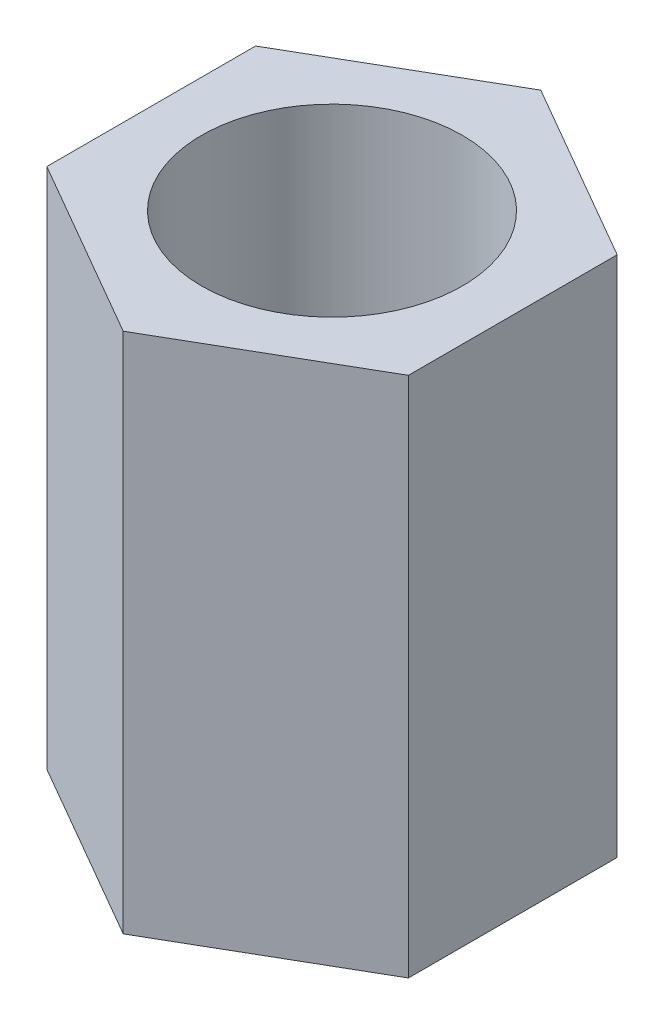
ISO-10303-21;
HEADER;
FILE_DESCRIPTION(('STEP AP214'),'2;1');
FILE_NAME('part.step','',(''),(''),'','','');
FILE_SCHEMA(('AUTOMOTIVE_DESIGN { 1 0 10303 214 1 1 1 1 }'));
ENDSEC;
DATA;
#1=APPLICATION_CONTEXT('core data for automotive mechanical design processes');
#2=APPLICATION_PROTOCOL_DEFINITION('international standard','automotive_design',2000,#1);
#3=PRODUCT_CONTEXT('',#1,'mechanical');
#4=PRODUCT('Part','Part','',(#3));
#5=PRODUCT_RELATED_PRODUCT_CATEGORY('part','',(#4));
#6=PRODUCT_DEFINITION_FORMATION('','',#4);
#7=PRODUCT_DEFINITION_CONTEXT('part definition',#1,'design');
#8=PRODUCT_DEFINITION('design','',#6,#7);
#9=PRODUCT_DEFINITION_SHAPE('','',#8);
#10=(LENGTH_UNIT() NAMED_UNIT(*) SI_UNIT(.MILLI.,.METRE.));
#11=(NAMED_UNIT(*) PLANE_ANGLE_UNIT() SI_UNIT($,.RADIAN.));
#12=(NAMED_UNIT(*) SI_UNIT($,.STERADIAN.) SOLID_ANGLE_UNIT());
#13=UNCERTAINTY_MEASURE_WITH_UNIT(LENGTH_MEASURE(1.E-05),#10,'distance_accuracy_value','');
#14=(GEOMETRIC_REPRESENTATION_CONTEXT(3) GLOBAL_UNCERTAINTY_ASSIGNED_CONTEXT((#13)) GLOBAL_UNIT_ASSIGNED_CONTEXT((#10,
#11,#12)) REPRESENTATION_CONTEXT('',''));
#15=CARTESIAN_POINT('',(0.,0.,0.));
#16=DIRECTION('',(0.,0.,1.));
#17=DIRECTION('',(1.,0.,0.));
#18=AXIS2_PLACEMENT_3D('',#15,#16,#17);
#19=CARTESIAN_POINT('',(0.,5.,0.));
#20=DIRECTION('',(0.,1.,0.));
#21=DIRECTION('',(0.,0.,1.));
#22=AXIS2_PLACEMENT_3D('',#19,#20,#21);
#23=PLANE('',#22);
#24=DIRECTION('',(-0.866025403784439,0.,-0.5));
#25=VECTOR('',#24,1.);
#26=CARTESIAN_POINT('',(1.73205080756888,5.,-1.));
#27=LINE('',#26,#25);
#28=CARTESIAN_POINT('',(1.73205080756888,5.,-1.));
#29=VERTEX_POINT('',#28);
#30=CARTESIAN_POINT('',(0.,5.,-2.));
#31=VERTEX_POINT('',#30);
#32=EDGE_CURVE('E137',#29,#31,#27,.T.);
#33=ORIENTED_EDGE('',*,*,#32,.T.);
#34=DIRECTION('',(-0.866025403784439,0.,0.5));
#35=VECTOR('',#34,1.);
#36=CARTESIAN_POINT('',(0.,5.,-2.));
#37=LINE('',#36,#35);
#38=CARTESIAN_POINT('',(-1.73205080756888,5.,-1.));
#39=VERTEX_POINT('',#38);
#40=EDGE_CURVE('E95',#31,#39,#37,.T.);
#41=ORIENTED_EDGE('',*,*,#40,.T.);
#42=DIRECTION('',(0.,0.,1.));
#43=VECTOR('',#42,1.);
#44=CARTESIAN_POINT('',(-1.73205080756888,5.,-1.));
#45=LINE('',#44,#43);
#46=CARTESIAN_POINT('',(-1.73205080756888,5.,1.));
#47=VERTEX_POINT('',#46);
#48=EDGE_CURVE('E108',#39,#47,#45,.T.);
#49=ORIENTED_EDGE('',*,*,#48,.T.);
#50=DIRECTION('',(0.866025403784439,0.,0.5));
#51=VECTOR('',#50,1.);
#52=CARTESIAN_POINT('',(-1.73205080756888,5.,1.));
#53=LINE('',#52,#51);
#54=CARTESIAN_POINT('',(0.,5.,2.));
#55=VERTEX_POINT('',#54);
#56=EDGE_CURVE('E102',#47,#55,#53,.T.);
#57=ORIENTED_EDGE('',*,*,#56,.T.);
#58=DIRECTION('',(0.866025403784439,0.,-0.5));
#59=VECTOR('',#58,1.);
#60=CARTESIAN_POINT('',(0.,5.,2.));
#61=LINE('',#60,#59);
#62=CARTESIAN_POINT('',(1.73205080756888,5.,1.));
#63=VERTEX_POINT('',#62);
#64=EDGE_CURVE('E106',#55,#63,#61,.T.);
#65=ORIENTED_EDGE('',*,*,#64,.T.);
#66=DIRECTION('',(0.,0.,-1.));
#67=VECTOR('',#66,1.);
#68=CARTESIAN_POINT('',(1.73205080756888,5.,1.));
#69=LINE('',#68,#67);
#70=EDGE_CURVE('E58',#63,#29,#69,.T.);
#71=ORIENTED_EDGE('',*,*,#70,.T.);
#72=EDGE_LOOP('',(#33,#41,#49,#57,#65,#71));
#73=FACE_BOUND('',#72,.T.);
#74=CARTESIAN_POINT('',(0.,5.,0.));
#75=DIRECTION('',(0.,1.,0.));
#76=DIRECTION('',(0.,0.,1.));
#77=AXIS2_PLACEMENT_3D('',#74,#75,#76);
#78=CIRCLE('',#77,1.25);
#79=CARTESIAN_POINT('',(0.,5.,1.25));
#80=VERTEX_POINT('',#79);
#81=EDGE_CURVE('E130',#80,#80,#78,.T.);
#82=ORIENTED_EDGE('',*,*,#81,.F.);
#83=EDGE_LOOP('',(#82));
#84=FACE_BOUND('',#83,.T.);
#85=ADVANCED_FACE('F41',(#73,#84),#23,.T.);
#86=CARTESIAN_POINT('',(0.,0.,0.));
#87=DIRECTION('',(0.,1.,0.));
#88=DIRECTION('',(0.,0.,1.));
#89=AXIS2_PLACEMENT_3D('',#86,#87,#88);
#90=PLANE('',#89);
#91=DIRECTION('',(-0.866025403784439,0.,-0.5));
#92=VECTOR('',#91,1.);
#93=CARTESIAN_POINT('',(1.73205080756888,0.,-1.));
#94=LINE('',#93,#92);
#95=CARTESIAN_POINT('',(1.73205080756888,0.,-1.));
#96=VERTEX_POINT('',#95);
#97=CARTESIAN_POINT('',(0.,0.,-2.));
#98=VERTEX_POINT('',#97);
#99=EDGE_CURVE('E126',#96,#98,#94,.T.);
#100=ORIENTED_EDGE('',*,*,#99,.F.);
#101=DIRECTION('',(0.,0.,-1.));
#102=VECTOR('',#101,1.);
#103=CARTESIAN_POINT('',(1.73205080756888,0.,1.));
#104=LINE('',#103,#102);
#105=CARTESIAN_POINT('',(1.73205080756888,0.,1.));
#106=VERTEX_POINT('',#105);
#107=EDGE_CURVE('E87',#106,#96,#104,.T.);
#108=ORIENTED_EDGE('',*,*,#107,.F.);
#109=DIRECTION('',(0.866025403784439,0.,-0.5));
#110=VECTOR('',#109,1.);
#111=CARTESIAN_POINT('',(0.,0.,2.));
#112=LINE('',#111,#110);
#113=CARTESIAN_POINT('',(0.,0.,2.));
#114=VERTEX_POINT('',#113);
#115=EDGE_CURVE('E81',#114,#106,#112,.T.);
#116=ORIENTED_EDGE('',*,*,#115,.F.);
#117=DIRECTION('',(0.866025403784439,0.,0.5));
#118=VECTOR('',#117,1.);
#119=CARTESIAN_POINT('',(-1.73205080756888,0.,1.));
#120=LINE('',#119,#118);
#121=CARTESIAN_POINT('',(-1.73205080756888,0.,1.));
#122=VERTEX_POINT('',#121);
#123=EDGE_CURVE('E116',#122,#114,#120,.T.);
#124=ORIENTED_EDGE('',*,*,#123,.F.);
#125=DIRECTION('',(0.,0.,1.));
#126=VECTOR('',#125,1.);
#127=CARTESIAN_POINT('',(-1.73205080756888,0.,-1.));
#128=LINE('',#127,#126);
#129=CARTESIAN_POINT('',(-1.73205080756888,0.,-1.));
#130=VERTEX_POINT('',#129);
#131=EDGE_CURVE('E132',#130,#122,#128,.T.);
#132=ORIENTED_EDGE('',*,*,#131,.F.);
#133=DIRECTION('',(-0.866025403784439,0.,0.5));
#134=VECTOR('',#133,1.);
#135=CARTESIAN_POINT('',(0.,0.,-2.));
#136=LINE('',#135,#134);
#137=EDGE_CURVE('E129',#98,#130,#136,.T.);
#138=ORIENTED_EDGE('',*,*,#137,.F.);
#139=EDGE_LOOP('',(#100,#108,#116,#124,#132,#138));
#140=FACE_BOUND('',#139,.T.);
#141=CARTESIAN_POINT('',(0.,0.,0.));
#142=DIRECTION('',(0.,1.,0.));
#143=DIRECTION('',(0.,0.,1.));
#144=AXIS2_PLACEMENT_3D('',#141,#142,#143);
#145=CIRCLE('',#144,1.25);
#146=CARTESIAN_POINT('',(0.,0.,1.25));
#147=VERTEX_POINT('',#146);
#148=EDGE_CURVE('E230',#147,#147,#145,.T.);
#149=ORIENTED_EDGE('',*,*,#148,.T.);
#150=EDGE_LOOP('',(#149));
#151=FACE_BOUND('',#150,.T.);
#152=ADVANCED_FACE('F146',(#140,#151),#90,.F.);
#153=CARTESIAN_POINT('',(1.73205080756888,5.,-1.));
#154=DIRECTION('',(-0.5,0.,0.866025403784439));
#155=DIRECTION('',(0.866025403784439,0.,0.5));
#156=AXIS2_PLACEMENT_3D('',#153,#154,#155);
#157=PLANE('',#156);
#158=ORIENTED_EDGE('',*,*,#99,.T.);
#159=DIRECTION('',(0.,-1.,0.));
#160=VECTOR('',#159,1.);
#161=CARTESIAN_POINT('',(0.,5.,-2.));
#162=LINE('',#161,#160);
#163=EDGE_CURVE('E11',#31,#98,#162,.T.);
#164=ORIENTED_EDGE('',*,*,#163,.F.);
#165=ORIENTED_EDGE('',*,*,#32,.F.);
#166=DIRECTION('',(0.,-1.,0.));
#167=VECTOR('',#166,1.);
#168=CARTESIAN_POINT('',(1.73205080756888,5.,-1.));
#169=LINE('',#168,#167);
#170=EDGE_CURVE('E122',#29,#96,#169,.T.);
#171=ORIENTED_EDGE('',*,*,#170,.T.);
#172=EDGE_LOOP('',(#158,#164,#165,#171));
#173=FACE_BOUND('',#172,.T.);
#174=ADVANCED_FACE('F43',(#173),#157,.F.);
#175=CARTESIAN_POINT('',(0.,5.,-2.));
#176=DIRECTION('',(0.5,0.,0.866025403784439));
#177=DIRECTION('',(0.866025403784439,0.,-0.5));
#178=AXIS2_PLACEMENT_3D('',#175,#176,#177);
#179=PLANE('',#178);
#180=ORIENTED_EDGE('',*,*,#137,.T.);
#181=DIRECTION('',(0.,-1.,0.));
#182=VECTOR('',#181,1.);
#183=CARTESIAN_POINT('',(-1.73205080756888,5.,-1.));
#184=LINE('',#183,#182);
#185=EDGE_CURVE('E50',#39,#130,#184,.T.);
#186=ORIENTED_EDGE('',*,*,#185,.F.);
#187=ORIENTED_EDGE('',*,*,#40,.F.);
#188=ORIENTED_EDGE('',*,*,#163,.T.);
#189=EDGE_LOOP('',(#180,#186,#187,#188));
#190=FACE_BOUND('',#189,.T.);
#191=ADVANCED_FACE('F171',(#190),#179,.F.);
#192=CARTESIAN_POINT('',(-1.73205080756888,5.,-1.));
#193=DIRECTION('',(1.,0.,0.));
#194=DIRECTION('',(0.,0.,-1.));
#195=AXIS2_PLACEMENT_3D('',#192,#193,#194);
#196=PLANE('',#195);
#197=ORIENTED_EDGE('',*,*,#131,.T.);
#198=DIRECTION('',(0.,-1.,0.));
#199=VECTOR('',#198,1.);
#200=CARTESIAN_POINT('',(-1.73205080756888,5.,1.));
#201=LINE('',#200,#199);
#202=EDGE_CURVE('E117',#47,#122,#201,.T.);
#203=ORIENTED_EDGE('',*,*,#202,.F.);
#204=ORIENTED_EDGE('',*,*,#48,.F.);
#205=ORIENTED_EDGE('',*,*,#185,.T.);
#206=EDGE_LOOP('',(#197,#203,#204,#205));
#207=FACE_BOUND('',#206,.T.);
#208=ADVANCED_FACE('F143',(#207),#196,.F.);
#209=CARTESIAN_POINT('',(-1.73205080756888,5.,1.));
#210=DIRECTION('',(0.5,0.,-0.866025403784438));
#211=DIRECTION('',(-0.866025403784439,0.,-0.5));
#212=AXIS2_PLACEMENT_3D('',#209,#210,#211);
#213=PLANE('',#212);
#214=ORIENTED_EDGE('',*,*,#123,.T.);
#215=DIRECTION('',(0.,-1.,0.));
#216=VECTOR('',#215,1.);
#217=CARTESIAN_POINT('',(0.,5.,2.));
#218=LINE('',#217,#216);
#219=EDGE_CURVE('E113',#55,#114,#218,.T.);
#220=ORIENTED_EDGE('',*,*,#219,.F.);
#221=ORIENTED_EDGE('',*,*,#56,.F.);
#222=ORIENTED_EDGE('',*,*,#202,.T.);
#223=EDGE_LOOP('',(#214,#220,#221,#222));
#224=FACE_BOUND('',#223,.T.);
#225=ADVANCED_FACE('F114',(#224),#213,.F.);
#226=CARTESIAN_POINT('',(0.,5.,2.));
#227=DIRECTION('',(-0.5,0.,-0.866025403784439));
#228=DIRECTION('',(-0.866025403784439,0.,0.5));
#229=AXIS2_PLACEMENT_3D('',#226,#227,#228);
#230=PLANE('',#229);
#231=ORIENTED_EDGE('',*,*,#115,.T.);
#232=DIRECTION('',(0.,-1.,0.));
#233=VECTOR('',#232,1.);
#234=CARTESIAN_POINT('',(1.73205080756888,5.,1.));
#235=LINE('',#234,#233);
#236=EDGE_CURVE('E118',#63,#106,#235,.T.);
#237=ORIENTED_EDGE('',*,*,#236,.F.);
#238=ORIENTED_EDGE('',*,*,#64,.F.);
#239=ORIENTED_EDGE('',*,*,#219,.T.);
#240=EDGE_LOOP('',(#231,#237,#238,#239));
#241=FACE_BOUND('',#240,.T.);
#242=ADVANCED_FACE('F120',(#241),#230,.F.);
#243=CARTESIAN_POINT('',(1.73205080756888,5.,1.));
#244=DIRECTION('',(-1.,0.,0.));
#245=DIRECTION('',(0.,0.,1.));
#246=AXIS2_PLACEMENT_3D('',#243,#244,#245);
#247=PLANE('',#246);
#248=ORIENTED_EDGE('',*,*,#107,.T.);
#249=ORIENTED_EDGE('',*,*,#170,.F.);
#250=ORIENTED_EDGE('',*,*,#70,.F.);
#251=ORIENTED_EDGE('',*,*,#236,.T.);
#252=EDGE_LOOP('',(#248,#249,#250,#251));
#253=FACE_BOUND('',#252,.T.);
#254=ADVANCED_FACE('F151',(#253),#247,.F.);
#255=CARTESIAN_POINT('',(0.,5.,0.));
#256=DIRECTION('',(0.,-1.,0.));
#257=DIRECTION('',(0.,0.,-1.));
#258=AXIS2_PLACEMENT_3D('',#255,#256,#257);
#259=CYLINDRICAL_SURFACE('',#258,1.25);
#260=ORIENTED_EDGE('',*,*,#81,.T.);
#261=EDGE_LOOP('',(#260));
#262=FACE_BOUND('',#261,.T.);
#263=ORIENTED_EDGE('',*,*,#148,.F.);
#264=EDGE_LOOP('',(#263));
#265=FACE_BOUND('',#264,.T.);
#266=ADVANCED_FACE('F153',(#262,#265),#259,.F.);
#267=CLOSED_SHELL('',(#85,#152,#174,#191,#208,#225,#242,#254,#266));
#268=MANIFOLD_SOLID_BREP('B2',#267);
#269=ADVANCED_BREP_SHAPE_REPRESENTATION('',(#18,#268),#14);
#270=SHAPE_DEFINITION_REPRESENTATION(#9,#269);
ENDSEC;
END-ISO-10303-21;
